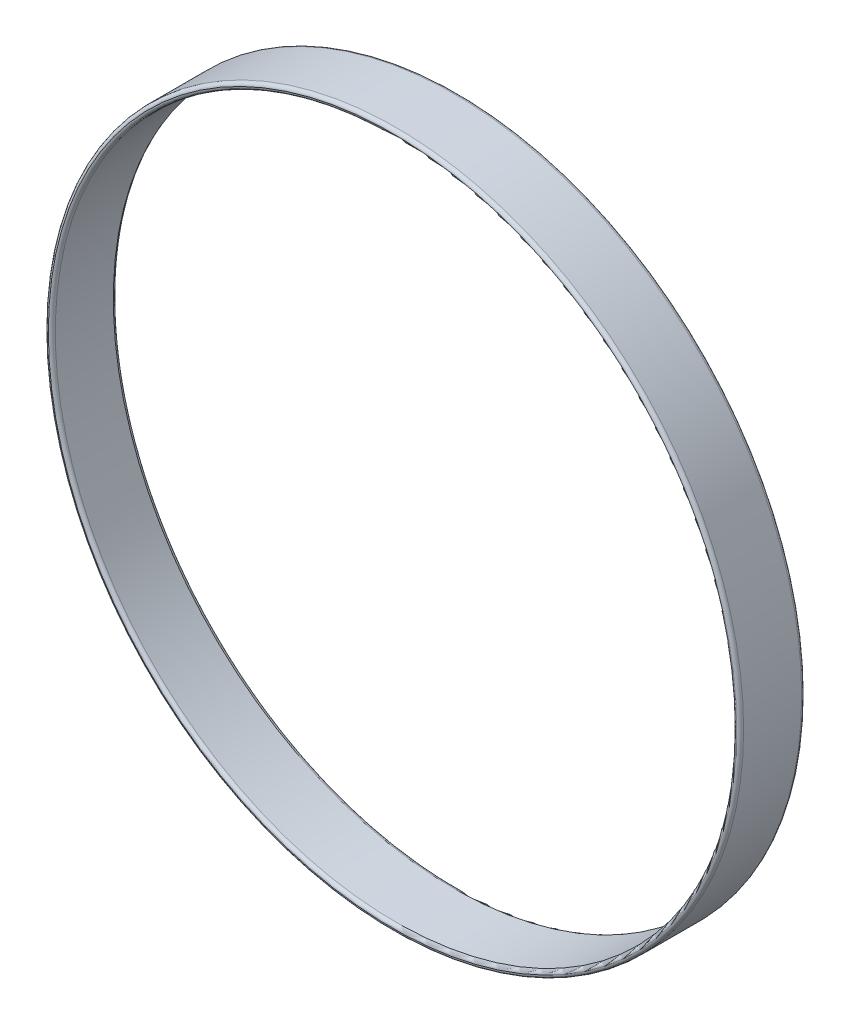
ISO-10303-21;
HEADER;
FILE_DESCRIPTION(('STEP AP214'),'2;1');
FILE_NAME('part.step','',(''),(''),'','','');
FILE_SCHEMA(('AUTOMOTIVE_DESIGN { 1 0 10303 214 1 1 1 1 }'));
ENDSEC;
DATA;
#1=APPLICATION_CONTEXT('core data for automotive mechanical design processes');
#2=APPLICATION_PROTOCOL_DEFINITION('international standard','automotive_design',2000,#1);
#3=PRODUCT_CONTEXT('',#1,'mechanical');
#4=PRODUCT('Part','Part','',(#3));
#5=PRODUCT_RELATED_PRODUCT_CATEGORY('part','',(#4));
#6=PRODUCT_DEFINITION_FORMATION('','',#4);
#7=PRODUCT_DEFINITION_CONTEXT('part definition',#1,'design');
#8=PRODUCT_DEFINITION('design','',#6,#7);
#9=PRODUCT_DEFINITION_SHAPE('','',#8);
#10=(LENGTH_UNIT() NAMED_UNIT(*) SI_UNIT(.MILLI.,.METRE.));
#11=(NAMED_UNIT(*) PLANE_ANGLE_UNIT() SI_UNIT($,.RADIAN.));
#12=(NAMED_UNIT(*) SI_UNIT($,.STERADIAN.) SOLID_ANGLE_UNIT());
#13=UNCERTAINTY_MEASURE_WITH_UNIT(LENGTH_MEASURE(1.E-05),#10,'distance_accuracy_value','');
#14=(GEOMETRIC_REPRESENTATION_CONTEXT(3) GLOBAL_UNCERTAINTY_ASSIGNED_CONTEXT((#13)) GLOBAL_UNIT_ASSIGNED_CONTEXT((#10,
#11,#12)) REPRESENTATION_CONTEXT('',''));
#15=CARTESIAN_POINT('',(0.,0.,0.));
#16=DIRECTION('',(0.,0.,1.));
#17=DIRECTION('',(1.,0.,0.));
#18=AXIS2_PLACEMENT_3D('',#15,#16,#17);
#19=CARTESIAN_POINT('',(0.,0.,9.35));
#20=DIRECTION('',(0.,0.,-1.));
#21=DIRECTION('',(-1.,0.,0.));
#22=AXIS2_PLACEMENT_3D('',#19,#20,#21);
#23=CYLINDRICAL_SURFACE('',#22,50.);
#24=CARTESIAN_POINT('',(0.,0.,0.5));
#25=DIRECTION('',(0.,0.,1.));
#26=DIRECTION('',(1.,0.,0.));
#27=AXIS2_PLACEMENT_3D('',#24,#25,#26);
#28=CIRCLE('',#27,50.);
#29=CARTESIAN_POINT('',(50.,0.,0.5));
#30=VERTEX_POINT('',#29);
#31=EDGE_CURVE('E44',#30,#30,#28,.T.);
#32=ORIENTED_EDGE('',*,*,#31,.T.);
#33=EDGE_LOOP('',(#32));
#34=FACE_BOUND('',#33,.T.);
#35=CARTESIAN_POINT('',(0.,0.,8.85));
#36=DIRECTION('',(0.,0.,1.));
#37=DIRECTION('',(1.,0.,0.));
#38=AXIS2_PLACEMENT_3D('',#35,#36,#37);
#39=CIRCLE('',#38,50.);
#40=CARTESIAN_POINT('',(50.,0.,8.85));
#41=VERTEX_POINT('',#40);
#42=EDGE_CURVE('E49',#41,#41,#39,.F.);
#43=ORIENTED_EDGE('',*,*,#42,.T.);
#44=EDGE_LOOP('',(#43));
#45=FACE_BOUND('',#44,.T.);
#46=ADVANCED_FACE('F31',(#34,#45),#23,.T.);
#47=CARTESIAN_POINT('',(0.,0.,9.35));
#48=DIRECTION('',(0.,0.,-1.));
#49=DIRECTION('',(-1.,0.,0.));
#50=AXIS2_PLACEMENT_3D('',#47,#48,#49);
#51=CYLINDRICAL_SURFACE('',#50,49.);
#52=CARTESIAN_POINT('',(0.,0.,0.5));
#53=DIRECTION('',(0.,0.,1.));
#54=DIRECTION('',(1.,0.,0.));
#55=AXIS2_PLACEMENT_3D('',#52,#53,#54);
#56=CIRCLE('',#55,49.);
#57=CARTESIAN_POINT('',(49.,0.,0.5));
#58=VERTEX_POINT('',#57);
#59=EDGE_CURVE('E10',#58,#58,#56,.F.);
#60=ORIENTED_EDGE('',*,*,#59,.T.);
#61=EDGE_LOOP('',(#60));
#62=FACE_BOUND('',#61,.T.);
#63=CARTESIAN_POINT('',(0.,0.,8.85));
#64=DIRECTION('',(0.,0.,1.));
#65=DIRECTION('',(1.,0.,0.));
#66=AXIS2_PLACEMENT_3D('',#63,#64,#65);
#67=CIRCLE('',#66,49.);
#68=CARTESIAN_POINT('',(49.,0.,8.85));
#69=VERTEX_POINT('',#68);
#70=EDGE_CURVE('E39',#69,#69,#67,.T.);
#71=ORIENTED_EDGE('',*,*,#70,.T.);
#72=EDGE_LOOP('',(#71));
#73=FACE_BOUND('',#72,.T.);
#74=ADVANCED_FACE('F71',(#62,#73),#51,.F.);
#75=CARTESIAN_POINT('',(0.,0.,0.5));
#76=DIRECTION('',(0.,0.,1.));
#77=DIRECTION('',(1.,0.,0.));
#78=AXIS2_PLACEMENT_3D('',#75,#76,#77);
#79=TOROIDAL_SURFACE('',#78,49.5,0.5);
#80=ORIENTED_EDGE('',*,*,#59,.F.);
#81=EDGE_LOOP('',(#80));
#82=FACE_BOUND('',#81,.T.);
#83=CARTESIAN_POINT('',(0.,0.,0.));
#84=DIRECTION('',(0.,0.,1.));
#85=DIRECTION('',(1.,0.,0.));
#86=AXIS2_PLACEMENT_3D('',#83,#84,#85);
#87=CIRCLE('',#86,49.5);
#88=CARTESIAN_POINT('',(49.5,0.,0.));
#89=VERTEX_POINT('',#88);
#90=EDGE_CURVE('E47',#89,#89,#87,.T.);
#91=ORIENTED_EDGE('',*,*,#90,.F.);
#92=EDGE_LOOP('',(#91));
#93=FACE_BOUND('',#92,.T.);
#94=ADVANCED_FACE('F67',(#82,#93),#79,.T.);
#95=CARTESIAN_POINT('',(0.,0.,0.5));
#96=DIRECTION('',(0.,0.,1.));
#97=DIRECTION('',(1.,0.,0.));
#98=AXIS2_PLACEMENT_3D('',#95,#96,#97);
#99=TOROIDAL_SURFACE('',#98,49.5,0.5);
#100=ORIENTED_EDGE('',*,*,#90,.T.);
#101=EDGE_LOOP('',(#100));
#102=FACE_BOUND('',#101,.T.);
#103=ORIENTED_EDGE('',*,*,#31,.F.);
#104=EDGE_LOOP('',(#103));
#105=FACE_BOUND('',#104,.T.);
#106=ADVANCED_FACE('F60',(#102,#105),#99,.T.);
#107=CARTESIAN_POINT('',(0.,0.,8.85));
#108=DIRECTION('',(0.,0.,1.));
#109=DIRECTION('',(1.,0.,0.));
#110=AXIS2_PLACEMENT_3D('',#107,#108,#109);
#111=TOROIDAL_SURFACE('',#110,49.5,0.5);
#112=ORIENTED_EDGE('',*,*,#70,.F.);
#113=EDGE_LOOP('',(#112));
#114=FACE_BOUND('',#113,.T.);
#115=CARTESIAN_POINT('',(0.,0.,9.35));
#116=DIRECTION('',(0.,0.,1.));
#117=DIRECTION('',(1.,0.,0.));
#118=AXIS2_PLACEMENT_3D('',#115,#116,#117);
#119=CIRCLE('',#118,49.5);
#120=CARTESIAN_POINT('',(49.5,0.,9.35));
#121=VERTEX_POINT('',#120);
#122=EDGE_CURVE('E35',#121,#121,#119,.F.);
#123=ORIENTED_EDGE('',*,*,#122,.F.);
#124=EDGE_LOOP('',(#123));
#125=FACE_BOUND('',#124,.T.);
#126=ADVANCED_FACE('F33',(#114,#125),#111,.T.);
#127=CARTESIAN_POINT('',(0.,0.,8.85));
#128=DIRECTION('',(0.,0.,1.));
#129=DIRECTION('',(1.,0.,0.));
#130=AXIS2_PLACEMENT_3D('',#127,#128,#129);
#131=TOROIDAL_SURFACE('',#130,49.5,0.5);
#132=ORIENTED_EDGE('',*,*,#42,.F.);
#133=EDGE_LOOP('',(#132));
#134=FACE_BOUND('',#133,.T.);
#135=ORIENTED_EDGE('',*,*,#122,.T.);
#136=EDGE_LOOP('',(#135));
#137=FACE_BOUND('',#136,.T.);
#138=ADVANCED_FACE('F57',(#134,#137),#131,.T.);
#139=CLOSED_SHELL('',(#46,#74,#94,#106,#126,#138));
#140=MANIFOLD_SOLID_BREP('B2',#139);
#141=ADVANCED_BREP_SHAPE_REPRESENTATION('',(#18,#140),#14);
#142=SHAPE_DEFINITION_REPRESENTATION(#9,#141);
ENDSEC;
END-ISO-10303-21;
